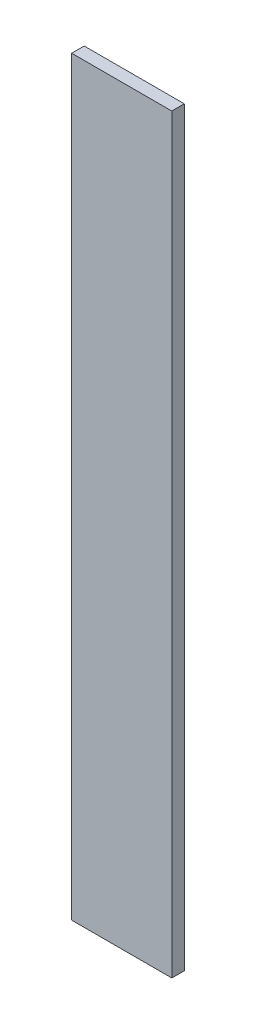
ISO-10303-21;
HEADER;
FILE_DESCRIPTION(('STEP AP214'),'2;1');
FILE_NAME('part.step','',(''),(''),'','','');
FILE_SCHEMA(('AUTOMOTIVE_DESIGN { 1 0 10303 214 1 1 1 1 }'));
ENDSEC;
DATA;
#1=APPLICATION_CONTEXT('core data for automotive mechanical design processes');
#2=APPLICATION_PROTOCOL_DEFINITION('international standard','automotive_design',2000,#1);
#3=PRODUCT_CONTEXT('',#1,'mechanical');
#4=PRODUCT('Part','Part','',(#3));
#5=PRODUCT_RELATED_PRODUCT_CATEGORY('part','',(#4));
#6=PRODUCT_DEFINITION_FORMATION('','',#4);
#7=PRODUCT_DEFINITION_CONTEXT('part definition',#1,'design');
#8=PRODUCT_DEFINITION('design','',#6,#7);
#9=PRODUCT_DEFINITION_SHAPE('','',#8);
#10=(LENGTH_UNIT() NAMED_UNIT(*) SI_UNIT(.MILLI.,.METRE.));
#11=(NAMED_UNIT(*) PLANE_ANGLE_UNIT() SI_UNIT($,.RADIAN.));
#12=(NAMED_UNIT(*) SI_UNIT($,.STERADIAN.) SOLID_ANGLE_UNIT());
#13=UNCERTAINTY_MEASURE_WITH_UNIT(LENGTH_MEASURE(1.E-05),#10,'distance_accuracy_value','');
#14=(GEOMETRIC_REPRESENTATION_CONTEXT(3) GLOBAL_UNCERTAINTY_ASSIGNED_CONTEXT((#13)) GLOBAL_UNIT_ASSIGNED_CONTEXT((#10,
#11,#12)) REPRESENTATION_CONTEXT('',''));
#15=CARTESIAN_POINT('',(0.,0.,0.));
#16=DIRECTION('',(0.,0.,1.));
#17=DIRECTION('',(1.,0.,0.));
#18=AXIS2_PLACEMENT_3D('',#15,#16,#17);
#19=CARTESIAN_POINT('',(-10.7,-6.2,0.));
#20=DIRECTION('',(0.,0.,1.));
#21=DIRECTION('',(1.,0.,0.));
#22=AXIS2_PLACEMENT_3D('',#19,#20,#21);
#23=PLANE('',#22);
#24=DIRECTION('',(0.,1.,0.));
#25=VECTOR('',#24,1.);
#26=CARTESIAN_POINT('',(-10.7,0.,0.));
#27=LINE('',#26,#25);
#28=CARTESIAN_POINT('',(-10.7,-6.2,0.));
#29=VERTEX_POINT('',#28);
#30=CARTESIAN_POINT('',(-10.7,8.8,0.));
#31=VERTEX_POINT('',#30);
#32=EDGE_CURVE('E55',#29,#31,#27,.T.);
#33=ORIENTED_EDGE('',*,*,#32,.T.);
#34=DIRECTION('',(1.,0.,0.));
#35=VECTOR('',#34,1.);
#36=CARTESIAN_POINT('',(-10.7,8.8,0.));
#37=LINE('',#36,#35);
#38=CARTESIAN_POINT('',(-12.7,8.8,0.));
#39=VERTEX_POINT('',#38);
#40=EDGE_CURVE('E67',#39,#31,#37,.T.);
#41=ORIENTED_EDGE('',*,*,#40,.F.);
#42=DIRECTION('',(0.,1.,0.));
#43=VECTOR('',#42,1.);
#44=CARTESIAN_POINT('',(-12.7,0.,0.));
#45=LINE('',#44,#43);
#46=CARTESIAN_POINT('',(-12.7,-6.2,0.));
#47=VERTEX_POINT('',#46);
#48=EDGE_CURVE('E20',#47,#39,#45,.T.);
#49=ORIENTED_EDGE('',*,*,#48,.F.);
#50=DIRECTION('',(1.,0.,0.));
#51=VECTOR('',#50,1.);
#52=CARTESIAN_POINT('',(-10.7,-6.2,0.));
#53=LINE('',#52,#51);
#54=EDGE_CURVE('E81',#29,#47,#53,.F.);
#55=ORIENTED_EDGE('',*,*,#54,.F.);
#56=EDGE_LOOP('',(#33,#41,#49,#55));
#57=FACE_BOUND('',#56,.T.);
#58=ADVANCED_FACE('F17',(#57),#23,.T.);
#59=CARTESIAN_POINT('',(-12.7,0.,0.));
#60=DIRECTION('',(-1.,0.,0.));
#61=DIRECTION('',(0.,0.,1.));
#62=AXIS2_PLACEMENT_3D('',#59,#60,#61);
#63=PLANE('',#62);
#64=ORIENTED_EDGE('',*,*,#48,.T.);
#65=DIRECTION('',(0.,0.,1.));
#66=VECTOR('',#65,1.);
#67=CARTESIAN_POINT('',(-12.7,8.8,0.));
#68=LINE('',#67,#66);
#69=CARTESIAN_POINT('',(-12.7,8.8,-0.25));
#70=VERTEX_POINT('',#69);
#71=EDGE_CURVE('E62',#70,#39,#68,.T.);
#72=ORIENTED_EDGE('',*,*,#71,.F.);
#73=DIRECTION('',(0.,1.,0.));
#74=VECTOR('',#73,1.);
#75=CARTESIAN_POINT('',(-12.7,8.8,-0.25));
#76=LINE('',#75,#74);
#77=CARTESIAN_POINT('',(-12.7,-6.2,-0.25));
#78=VERTEX_POINT('',#77);
#79=EDGE_CURVE('E83',#78,#70,#76,.T.);
#80=ORIENTED_EDGE('',*,*,#79,.F.);
#81=DIRECTION('',(0.,0.,-1.));
#82=VECTOR('',#81,1.);
#83=CARTESIAN_POINT('',(-12.7,-6.2,-0.25));
#84=LINE('',#83,#82);
#85=EDGE_CURVE('E65',#47,#78,#84,.T.);
#86=ORIENTED_EDGE('',*,*,#85,.F.);
#87=EDGE_LOOP('',(#64,#72,#80,#86));
#88=FACE_BOUND('',#87,.T.);
#89=ADVANCED_FACE('F60',(#88),#63,.T.);
#90=CARTESIAN_POINT('',(-10.7,8.8,0.));
#91=DIRECTION('',(0.,1.,0.));
#92=DIRECTION('',(0.,0.,1.));
#93=AXIS2_PLACEMENT_3D('',#90,#91,#92);
#94=PLANE('',#93);
#95=DIRECTION('',(0.,0.,1.));
#96=VECTOR('',#95,1.);
#97=CARTESIAN_POINT('',(-10.7,8.8,0.));
#98=LINE('',#97,#96);
#99=CARTESIAN_POINT('',(-10.7,8.8,-0.25));
#100=VERTEX_POINT('',#99);
#101=EDGE_CURVE('E77',#31,#100,#98,.F.);
#102=ORIENTED_EDGE('',*,*,#101,.T.);
#103=DIRECTION('',(-1.,0.,0.));
#104=VECTOR('',#103,1.);
#105=CARTESIAN_POINT('',(-10.7,8.8,-0.25));
#106=LINE('',#105,#104);
#107=EDGE_CURVE('E73',#70,#100,#106,.F.);
#108=ORIENTED_EDGE('',*,*,#107,.F.);
#109=ORIENTED_EDGE('',*,*,#71,.T.);
#110=ORIENTED_EDGE('',*,*,#40,.T.);
#111=EDGE_LOOP('',(#102,#108,#109,#110));
#112=FACE_BOUND('',#111,.T.);
#113=ADVANCED_FACE('F71',(#112),#94,.T.);
#114=CARTESIAN_POINT('',(-10.7,0.,0.));
#115=DIRECTION('',(-1.,0.,0.));
#116=DIRECTION('',(0.,0.,1.));
#117=AXIS2_PLACEMENT_3D('',#114,#115,#116);
#118=PLANE('',#117);
#119=ORIENTED_EDGE('',*,*,#101,.F.);
#120=ORIENTED_EDGE('',*,*,#32,.F.);
#121=DIRECTION('',(0.,0.,-1.));
#122=VECTOR('',#121,1.);
#123=CARTESIAN_POINT('',(-10.7,-6.2,-0.25));
#124=LINE('',#123,#122);
#125=CARTESIAN_POINT('',(-10.7,-6.2,-0.25));
#126=VERTEX_POINT('',#125);
#127=EDGE_CURVE('E35',#126,#29,#124,.F.);
#128=ORIENTED_EDGE('',*,*,#127,.F.);
#129=DIRECTION('',(0.,1.,0.));
#130=VECTOR('',#129,1.);
#131=CARTESIAN_POINT('',(-10.7,8.8,-0.25));
#132=LINE('',#131,#130);
#133=EDGE_CURVE('E26',#100,#126,#132,.F.);
#134=ORIENTED_EDGE('',*,*,#133,.F.);
#135=EDGE_LOOP('',(#119,#120,#128,#134));
#136=FACE_BOUND('',#135,.T.);
#137=ADVANCED_FACE('F89',(#136),#118,.F.);
#138=CARTESIAN_POINT('',(-10.7,-6.2,-0.25));
#139=DIRECTION('',(0.,-1.,0.));
#140=DIRECTION('',(0.,0.,-1.));
#141=AXIS2_PLACEMENT_3D('',#138,#139,#140);
#142=PLANE('',#141);
#143=ORIENTED_EDGE('',*,*,#127,.T.);
#144=ORIENTED_EDGE('',*,*,#54,.T.);
#145=ORIENTED_EDGE('',*,*,#85,.T.);
#146=DIRECTION('',(-1.,0.,0.));
#147=VECTOR('',#146,1.);
#148=CARTESIAN_POINT('',(-10.7,-6.2,-0.25));
#149=LINE('',#148,#147);
#150=EDGE_CURVE('E11',#126,#78,#149,.T.);
#151=ORIENTED_EDGE('',*,*,#150,.F.);
#152=EDGE_LOOP('',(#143,#144,#145,#151));
#153=FACE_BOUND('',#152,.T.);
#154=ADVANCED_FACE('F91',(#153),#142,.T.);
#155=CARTESIAN_POINT('',(-10.7,8.8,-0.25));
#156=DIRECTION('',(0.,0.,-1.));
#157=DIRECTION('',(-1.,0.,0.));
#158=AXIS2_PLACEMENT_3D('',#155,#156,#157);
#159=PLANE('',#158);
#160=ORIENTED_EDGE('',*,*,#133,.T.);
#161=ORIENTED_EDGE('',*,*,#150,.T.);
#162=ORIENTED_EDGE('',*,*,#79,.T.);
#163=ORIENTED_EDGE('',*,*,#107,.T.);
#164=EDGE_LOOP('',(#160,#161,#162,#163));
#165=FACE_BOUND('',#164,.T.);
#166=ADVANCED_FACE('F88',(#165),#159,.T.);
#167=CLOSED_SHELL('',(#58,#89,#113,#137,#154,#166));
#168=MANIFOLD_SOLID_BREP('B1',#167);
#169=ADVANCED_BREP_SHAPE_REPRESENTATION('',(#18,#168),#14);
#170=SHAPE_DEFINITION_REPRESENTATION(#9,#169);
ENDSEC;
END-ISO-10303-21;
